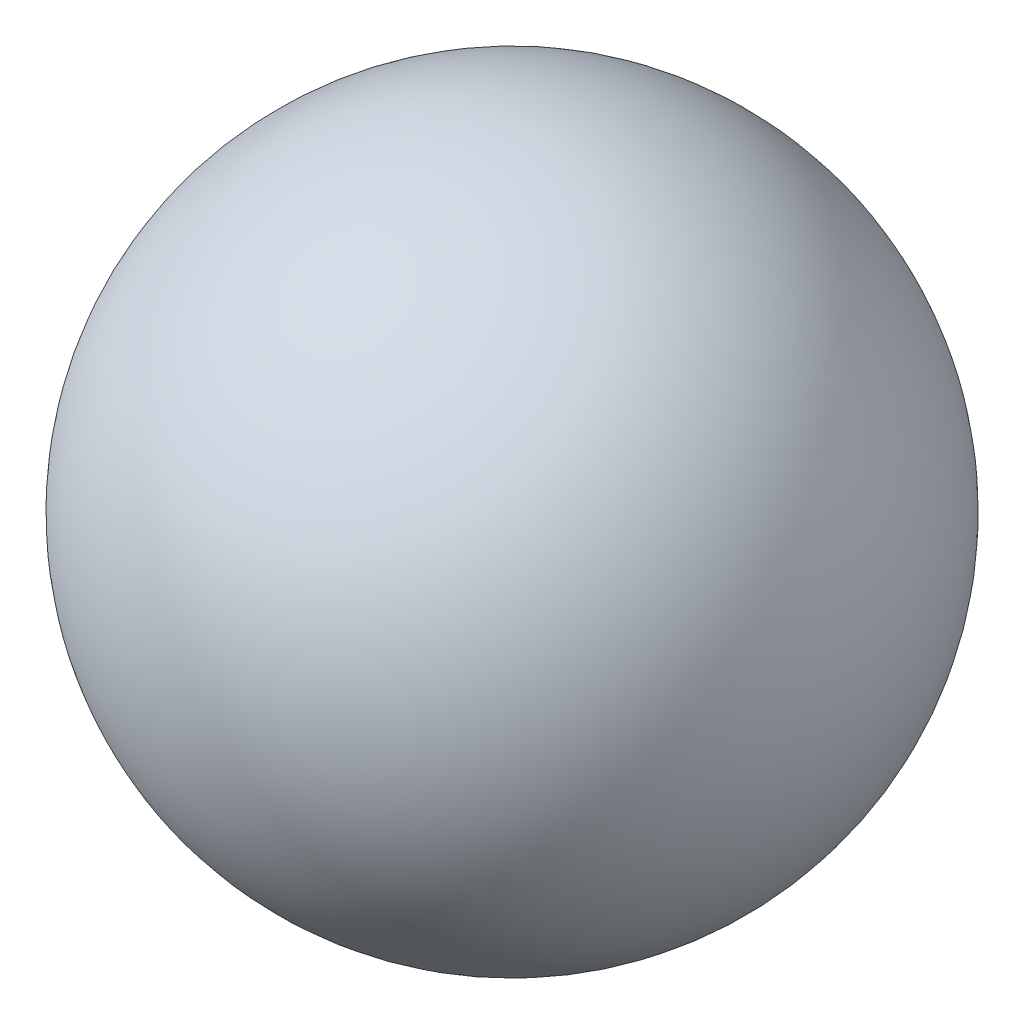
ISO-10303-21;
HEADER;
FILE_DESCRIPTION(('STEP AP214'),'2;1');
FILE_NAME('part.step','',(''),(''),'','','');
FILE_SCHEMA(('AUTOMOTIVE_DESIGN { 1 0 10303 214 1 1 1 1 }'));
ENDSEC;
DATA;
#1=APPLICATION_CONTEXT('core data for automotive mechanical design processes');
#2=APPLICATION_PROTOCOL_DEFINITION('international standard','automotive_design',2000,#1);
#3=PRODUCT_CONTEXT('',#1,'mechanical');
#4=PRODUCT('Part','Part','',(#3));
#5=PRODUCT_RELATED_PRODUCT_CATEGORY('part','',(#4));
#6=PRODUCT_DEFINITION_FORMATION('','',#4);
#7=PRODUCT_DEFINITION_CONTEXT('part definition',#1,'design');
#8=PRODUCT_DEFINITION('design','',#6,#7);
#9=PRODUCT_DEFINITION_SHAPE('','',#8);
#10=(LENGTH_UNIT() NAMED_UNIT(*) SI_UNIT(.MILLI.,.METRE.));
#11=(NAMED_UNIT(*) PLANE_ANGLE_UNIT() SI_UNIT($,.RADIAN.));
#12=(NAMED_UNIT(*) SI_UNIT($,.STERADIAN.) SOLID_ANGLE_UNIT());
#13=UNCERTAINTY_MEASURE_WITH_UNIT(LENGTH_MEASURE(1.E-05),#10,'distance_accuracy_value','');
#14=(GEOMETRIC_REPRESENTATION_CONTEXT(3) GLOBAL_UNCERTAINTY_ASSIGNED_CONTEXT((#13)) GLOBAL_UNIT_ASSIGNED_CONTEXT((#10,
#11,#12)) REPRESENTATION_CONTEXT('',''));
#15=CARTESIAN_POINT('',(0.,0.,0.));
#16=DIRECTION('',(0.,0.,1.));
#17=DIRECTION('',(1.,0.,0.));
#18=AXIS2_PLACEMENT_3D('',#15,#16,#17);
#19=CARTESIAN_POINT('',(0.,0.,0.));
#20=DIRECTION('',(0.,0.,1.));
#21=DIRECTION('',(-1.,0.,0.));
#22=AXIS2_PLACEMENT_3D('',#19,#20,#21);
#23=SPHERICAL_SURFACE('',#22,7.62);
#24=CARTESIAN_POINT('',(0.,0.,7.62));
#25=VERTEX_POINT('',#24);
#26=VERTEX_LOOP('',#25);
#27=FACE_BOUND('',#26,.T.);
#28=ADVANCED_FACE('F29',(#27),#23,.T.);
#29=CLOSED_SHELL('',(#28));
#30=MANIFOLD_SOLID_BREP('B2',#29);
#31=ADVANCED_BREP_SHAPE_REPRESENTATION('',(#18,#30),#14);
#32=SHAPE_DEFINITION_REPRESENTATION(#9,#31);
ENDSEC;
END-ISO-10303-21;
